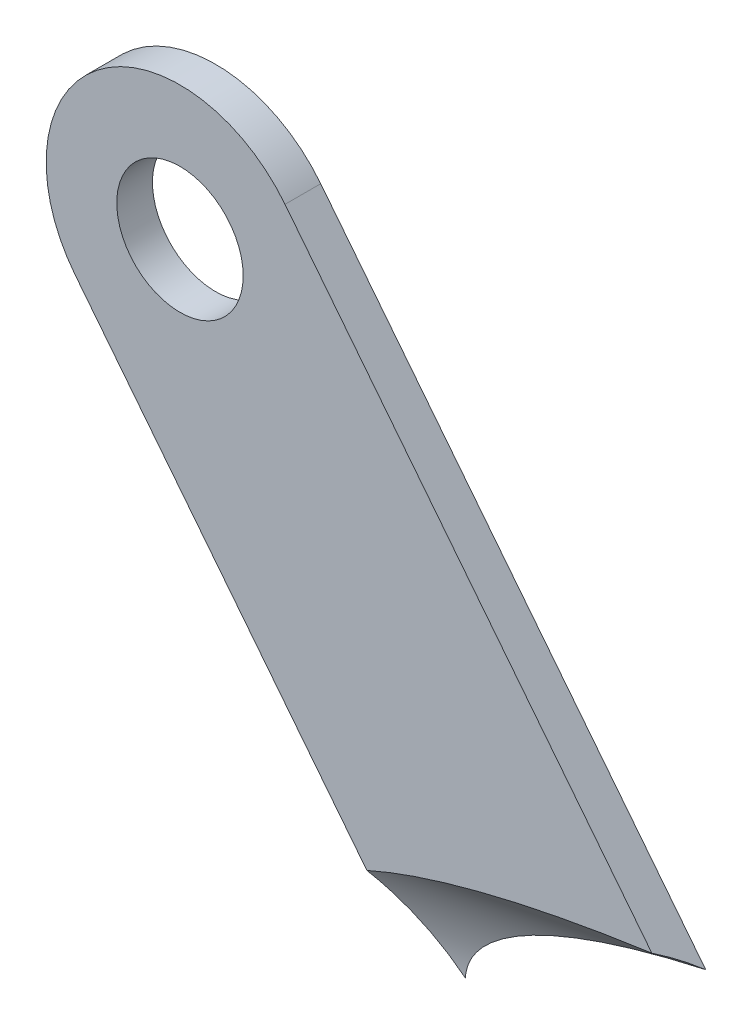
ISO-10303-21;
HEADER;
FILE_DESCRIPTION(('STEP AP214'),'2;1');
FILE_NAME('part.step','',(''),(''),'','','');
FILE_SCHEMA(('AUTOMOTIVE_DESIGN { 1 0 10303 214 1 1 1 1 }'));
ENDSEC;
DATA;
#1=APPLICATION_CONTEXT('core data for automotive mechanical design processes');
#2=APPLICATION_PROTOCOL_DEFINITION('international standard','automotive_design',2000,#1);
#3=PRODUCT_CONTEXT('',#1,'mechanical');
#4=PRODUCT('Part','Part','',(#3));
#5=PRODUCT_RELATED_PRODUCT_CATEGORY('part','',(#4));
#6=PRODUCT_DEFINITION_FORMATION('','',#4);
#7=PRODUCT_DEFINITION_CONTEXT('part definition',#1,'design');
#8=PRODUCT_DEFINITION('design','',#6,#7);
#9=PRODUCT_DEFINITION_SHAPE('','',#8);
#10=(LENGTH_UNIT() NAMED_UNIT(*) SI_UNIT(.MILLI.,.METRE.));
#11=(NAMED_UNIT(*) PLANE_ANGLE_UNIT() SI_UNIT($,.RADIAN.));
#12=(NAMED_UNIT(*) SI_UNIT($,.STERADIAN.) SOLID_ANGLE_UNIT());
#13=UNCERTAINTY_MEASURE_WITH_UNIT(LENGTH_MEASURE(1.E-05),#10,'distance_accuracy_value','');
#14=(GEOMETRIC_REPRESENTATION_CONTEXT(3) GLOBAL_UNCERTAINTY_ASSIGNED_CONTEXT((#13)) GLOBAL_UNIT_ASSIGNED_CONTEXT((#10,
#11,#12)) REPRESENTATION_CONTEXT('',''));
#15=CARTESIAN_POINT('',(0.,0.,0.));
#16=DIRECTION('',(0.,0.,1.));
#17=DIRECTION('',(1.,0.,0.));
#18=AXIS2_PLACEMENT_3D('',#15,#16,#17);
#19=CARTESIAN_POINT('',(42.4511070402585,33.48241263193,-2.54));
#20=DIRECTION('',(-0.7851671104735,-0.61928394830699,0.));
#21=DIRECTION('',(0.61928394830699,-0.7851671104735,0.));
#22=AXIS2_PLACEMENT_3D('',#19,#20,#21);
#23=PLANE('',#22);
#24=CARTESIAN_POINT('',(68.8596516888516,-1.26802418510897E-12,4.65871383980428));
#25=DIRECTION('',(0.7851671104735,0.61928394830699,0.));
#26=DIRECTION('',(0.577389463919438,-0.732050650178868,-0.361556707208593));
#27=AXIS2_PLACEMENT_3D('',#24,#25,#26);
#28=ELLIPSE('',#27,16.6347922740876,12.7);
#29=CARTESIAN_POINT('',(60.2709312934926,10.8893195018598,0.));
#30=VERTEX_POINT('',#29);
#31=CARTESIAN_POINT('',(61.5646642550422,9.24904354456871,-2.54));
#32=VERTEX_POINT('',#31);
#33=EDGE_CURVE('E11',#30,#32,#28,.F.);
#34=ORIENTED_EDGE('',*,*,#33,.T.);
#35=DIRECTION('',(-0.61928394830699,0.7851671104735,0.));
#36=VECTOR('',#35,1.);
#37=CARTESIAN_POINT('',(42.4511070402585,33.48241263193,-2.54));
#38=LINE('',#37,#36);
#39=CARTESIAN_POINT('',(34.1566239330499,43.9986796076241,-2.54));
#40=VERTEX_POINT('',#39);
#41=EDGE_CURVE('E100',#32,#40,#38,.T.);
#42=ORIENTED_EDGE('',*,*,#41,.T.);
#43=DIRECTION('',(0.,0.,1.));
#44=VECTOR('',#43,1.);
#45=CARTESIAN_POINT('',(34.1566239330499,43.9986796076241,-2.54));
#46=LINE('',#45,#44);
#47=CARTESIAN_POINT('',(34.1566239330499,43.9986796076241,0.));
#48=VERTEX_POINT('',#47);
#49=EDGE_CURVE('E95',#40,#48,#46,.T.);
#50=ORIENTED_EDGE('',*,*,#49,.T.);
#51=DIRECTION('',(-0.61928394830699,0.7851671104735,0.));
#52=VECTOR('',#51,1.);
#53=CARTESIAN_POINT('',(42.4511070402585,33.48241263193,0.));
#54=LINE('',#53,#52);
#55=EDGE_CURVE('E46',#30,#48,#54,.T.);
#56=ORIENTED_EDGE('',*,*,#55,.F.);
#57=EDGE_LOOP('',(#34,#42,#50,#56));
#58=FACE_BOUND('',#57,.T.);
#59=ADVANCED_FACE('F43',(#58),#23,.F.);
#60=CARTESIAN_POINT('',(26.6779072057898,38.1,-2.54));
#61=DIRECTION('',(0.,0.,1.));
#62=DIRECTION('',(-1.,0.,0.));
#63=AXIS2_PLACEMENT_3D('',#60,#61,#62);
#64=CYLINDRICAL_SURFACE('',#63,9.52500000000007);
#65=CARTESIAN_POINT('',(26.6779072057898,38.1,0.));
#66=DIRECTION('',(0.,0.,1.));
#67=DIRECTION('',(1.,0.,0.));
#68=AXIS2_PLACEMENT_3D('',#65,#66,#67);
#69=CIRCLE('',#68,9.52500000000007);
#70=CARTESIAN_POINT('',(19.1991904785297,32.2013203923759,0.));
#71=VERTEX_POINT('',#70);
#72=EDGE_CURVE('E96',#48,#71,#69,.T.);
#73=ORIENTED_EDGE('',*,*,#72,.F.);
#74=ORIENTED_EDGE('',*,*,#49,.F.);
#75=CARTESIAN_POINT('',(26.6779072057898,38.1,-2.54));
#76=DIRECTION('',(0.,0.,1.));
#77=DIRECTION('',(1.,0.,0.));
#78=AXIS2_PLACEMENT_3D('',#75,#76,#77);
#79=CIRCLE('',#78,9.52500000000007);
#80=CARTESIAN_POINT('',(19.1991904785297,32.2013203923759,-2.54));
#81=VERTEX_POINT('',#80);
#82=EDGE_CURVE('E106',#40,#81,#79,.T.);
#83=ORIENTED_EDGE('',*,*,#82,.T.);
#84=DIRECTION('',(0.,0.,1.));
#85=VECTOR('',#84,1.);
#86=CARTESIAN_POINT('',(19.1991904785297,32.2013203923759,-2.54));
#87=LINE('',#86,#85);
#88=EDGE_CURVE('E119',#81,#71,#87,.T.);
#89=ORIENTED_EDGE('',*,*,#88,.T.);
#90=EDGE_LOOP('',(#73,#74,#83,#89));
#91=FACE_BOUND('',#90,.T.);
#92=ADVANCED_FACE('F126',(#91),#64,.T.);
#93=CARTESIAN_POINT('',(27.4936735857383,21.6850534166819,-2.54));
#94=DIRECTION('',(-0.7851671104735,-0.61928394830699,0.));
#95=DIRECTION('',(0.61928394830699,-0.7851671104735,0.));
#96=AXIS2_PLACEMENT_3D('',#93,#94,#95);
#97=PLANE('',#96);
#98=DIRECTION('',(-0.61928394830699,0.7851671104735,0.));
#99=VECTOR('',#98,1.);
#100=CARTESIAN_POINT('',(27.4936735857383,21.6850534166819,0.));
#101=LINE('',#100,#99);
#102=CARTESIAN_POINT('',(39.9838197526282,5.84926112453741,0.));
#103=VERTEX_POINT('',#102);
#104=EDGE_CURVE('E89',#103,#71,#101,.T.);
#105=ORIENTED_EDGE('',*,*,#104,.T.);
#106=ORIENTED_EDGE('',*,*,#88,.F.);
#107=DIRECTION('',(-0.61928394830699,0.7851671104735,0.));
#108=VECTOR('',#107,1.);
#109=CARTESIAN_POINT('',(27.4936735857383,21.6850534166819,-2.54));
#110=LINE('',#109,#108);
#111=CARTESIAN_POINT('',(44.4541480665834,0.181497936533472,-2.54));
#112=VERTEX_POINT('',#111);
#113=EDGE_CURVE('E124',#112,#81,#110,.T.);
#114=ORIENTED_EDGE('',*,*,#113,.F.);
#115=CARTESIAN_POINT('',(44.5973007244669,-1.53784260298643E-12,10.4853794545125));
#116=DIRECTION('',(0.7851671104735,0.61928394830699,0.));
#117=DIRECTION('',(0.577389463919438,-0.732050650178868,-0.361556707208594));
#118=AXIS2_PLACEMENT_3D('',#115,#116,#117);
#119=ELLIPSE('',#118,16.6347922740876,12.7);
#120=EDGE_CURVE('E98',#103,#112,#119,.F.);
#121=ORIENTED_EDGE('',*,*,#120,.F.);
#122=EDGE_LOOP('',(#105,#106,#114,#121));
#123=FACE_BOUND('',#122,.T.);
#124=ADVANCED_FACE('F127',(#123),#97,.T.);
#125=CARTESIAN_POINT('',(26.6779072057898,38.1,-2.54));
#126=DIRECTION('',(0.,0.,1.));
#127=DIRECTION('',(-1.,0.,0.));
#128=AXIS2_PLACEMENT_3D('',#125,#126,#127);
#129=CYLINDRICAL_SURFACE('',#128,4.5);
#130=CARTESIAN_POINT('',(26.6779072057898,38.1,-2.54));
#131=DIRECTION('',(0.,0.,1.));
#132=DIRECTION('',(1.,0.,0.));
#133=AXIS2_PLACEMENT_3D('',#130,#131,#132);
#134=CIRCLE('',#133,4.5);
#135=CARTESIAN_POINT('',(31.1779072057898,38.1,-2.54));
#136=VERTEX_POINT('',#135);
#137=EDGE_CURVE('E101',#136,#136,#134,.T.);
#138=ORIENTED_EDGE('',*,*,#137,.F.);
#139=EDGE_LOOP('',(#138));
#140=FACE_BOUND('',#139,.T.);
#141=CARTESIAN_POINT('',(26.6779072057898,38.1,0.));
#142=DIRECTION('',(0.,0.,1.));
#143=DIRECTION('',(1.,0.,0.));
#144=AXIS2_PLACEMENT_3D('',#141,#142,#143);
#145=CIRCLE('',#144,4.5);
#146=CARTESIAN_POINT('',(31.1779072057898,38.1,0.));
#147=VERTEX_POINT('',#146);
#148=EDGE_CURVE('E90',#147,#147,#145,.T.);
#149=ORIENTED_EDGE('',*,*,#148,.T.);
#150=EDGE_LOOP('',(#149));
#151=FACE_BOUND('',#150,.T.);
#152=ADVANCED_FACE('F129',(#140,#151),#129,.F.);
#153=CARTESIAN_POINT('',(0.,0.,-2.54));
#154=DIRECTION('',(0.,0.,-1.));
#155=DIRECTION('',(1.,0.,0.));
#156=AXIS2_PLACEMENT_3D('',#153,#154,#155);
#157=PLANE('',#156);
#158=ORIENTED_EDGE('',*,*,#113,.T.);
#159=ORIENTED_EDGE('',*,*,#82,.F.);
#160=ORIENTED_EDGE('',*,*,#41,.F.);
#161=CARTESIAN_POINT('',(98.8352386236189,-9.34669620517943E-13,-2.54));
#162=DIRECTION('',(0.,0.,1.));
#163=DIRECTION('',(1.,0.,0.));
#164=AXIS2_PLACEMENT_3D('',#161,#162,#163);
#165=ELLIPSE('',#164,54.3866447426534,12.7);
#166=EDGE_CURVE('E60',#112,#32,#165,.F.);
#167=ORIENTED_EDGE('',*,*,#166,.F.);
#168=EDGE_LOOP('',(#158,#159,#160,#167));
#169=FACE_BOUND('',#168,.T.);
#170=ORIENTED_EDGE('',*,*,#137,.T.);
#171=EDGE_LOOP('',(#170));
#172=FACE_BOUND('',#171,.T.);
#173=ADVANCED_FACE('F103',(#169,#172),#157,.T.);
#174=CARTESIAN_POINT('',(0.,0.,0.));
#175=DIRECTION('',(0.,0.,-1.));
#176=DIRECTION('',(1.,0.,0.));
#177=AXIS2_PLACEMENT_3D('',#174,#175,#176);
#178=PLANE('',#177);
#179=CARTESIAN_POINT('',(88.2586283417496,-1.05229071407765E-12,0.));
#180=DIRECTION('',(0.,0.,1.));
#181=DIRECTION('',(1.,0.,0.));
#182=AXIS2_PLACEMENT_3D('',#179,#180,#181);
#183=ELLIPSE('',#182,54.3866447426534,12.7);
#184=EDGE_CURVE('E52',#103,#30,#183,.F.);
#185=ORIENTED_EDGE('',*,*,#184,.T.);
#186=ORIENTED_EDGE('',*,*,#55,.T.);
#187=ORIENTED_EDGE('',*,*,#72,.T.);
#188=ORIENTED_EDGE('',*,*,#104,.F.);
#189=EDGE_LOOP('',(#185,#186,#187,#188));
#190=FACE_BOUND('',#189,.T.);
#191=ORIENTED_EDGE('',*,*,#148,.F.);
#192=EDGE_LOOP('',(#191));
#193=FACE_BOUND('',#192,.T.);
#194=ADVANCED_FACE('F85',(#190,#193),#178,.F.);
#195=CARTESIAN_POINT('',(-131.590368485606,-3.49720252756924E-12,52.7972986674884));
#196=DIRECTION('',(0.97235362945404,0.,-0.23351321009218));
#197=DIRECTION('',(0.,1.,0.));
#198=AXIS2_PLACEMENT_3D('',#195,#196,#197);
#199=CYLINDRICAL_SURFACE('',#198,12.7);
#200=ORIENTED_EDGE('',*,*,#120,.T.);
#201=ORIENTED_EDGE('',*,*,#166,.T.);
#202=ORIENTED_EDGE('',*,*,#33,.F.);
#203=ORIENTED_EDGE('',*,*,#184,.F.);
#204=EDGE_LOOP('',(#200,#201,#202,#203));
#205=FACE_BOUND('',#204,.T.);
#206=ADVANCED_FACE('F97',(#205),#199,.F.);
#207=CLOSED_SHELL('',(#59,#92,#124,#152,#173,#194,#206));
#208=MANIFOLD_SOLID_BREP('B2',#207);
#209=ADVANCED_BREP_SHAPE_REPRESENTATION('',(#18,#208),#14);
#210=SHAPE_DEFINITION_REPRESENTATION(#9,#209);
ENDSEC;
END-ISO-10303-21;
